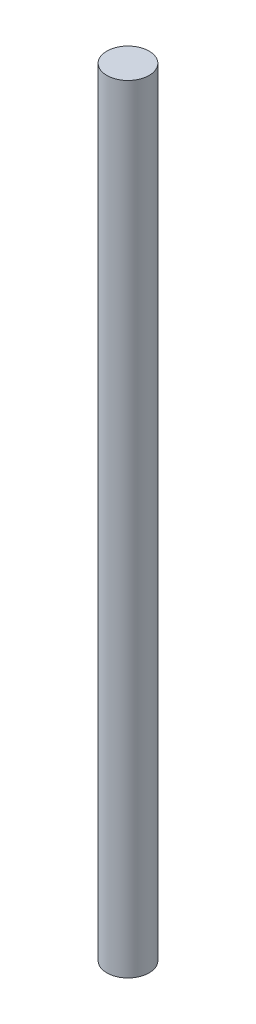
ISO-10303-21;
HEADER;
FILE_DESCRIPTION(('STEP AP214'),'2;1');
FILE_NAME('part.step','',(''),(''),'','','');
FILE_SCHEMA(('AUTOMOTIVE_DESIGN { 1 0 10303 214 1 1 1 1 }'));
ENDSEC;
DATA;
#1=APPLICATION_CONTEXT('core data for automotive mechanical design processes');
#2=APPLICATION_PROTOCOL_DEFINITION('international standard','automotive_design',2000,#1);
#3=PRODUCT_CONTEXT('',#1,'mechanical');
#4=PRODUCT('Part','Part','',(#3));
#5=PRODUCT_RELATED_PRODUCT_CATEGORY('part','',(#4));
#6=PRODUCT_DEFINITION_FORMATION('','',#4);
#7=PRODUCT_DEFINITION_CONTEXT('part definition',#1,'design');
#8=PRODUCT_DEFINITION('design','',#6,#7);
#9=PRODUCT_DEFINITION_SHAPE('','',#8);
#10=(LENGTH_UNIT() NAMED_UNIT(*) SI_UNIT(.MILLI.,.METRE.));
#11=(NAMED_UNIT(*) PLANE_ANGLE_UNIT() SI_UNIT($,.RADIAN.));
#12=(NAMED_UNIT(*) SI_UNIT($,.STERADIAN.) SOLID_ANGLE_UNIT());
#13=UNCERTAINTY_MEASURE_WITH_UNIT(LENGTH_MEASURE(1.E-05),#10,'distance_accuracy_value','');
#14=(GEOMETRIC_REPRESENTATION_CONTEXT(3) GLOBAL_UNCERTAINTY_ASSIGNED_CONTEXT((#13)) GLOBAL_UNIT_ASSIGNED_CONTEXT((#10,
#11,#12)) REPRESENTATION_CONTEXT('',''));
#15=CARTESIAN_POINT('',(0.,0.,0.));
#16=DIRECTION('',(0.,0.,1.));
#17=DIRECTION('',(1.,0.,0.));
#18=AXIS2_PLACEMENT_3D('',#15,#16,#17);
#19=CARTESIAN_POINT('',(0.,184.,0.));
#20=DIRECTION('',(0.,-1.,0.));
#21=DIRECTION('',(0.,0.,-1.));
#22=AXIS2_PLACEMENT_3D('',#19,#20,#21);
#23=CYLINDRICAL_SURFACE('',#22,5.);
#24=CARTESIAN_POINT('',(0.,184.,0.));
#25=DIRECTION('',(0.,1.,0.));
#26=DIRECTION('',(0.,0.,1.));
#27=AXIS2_PLACEMENT_3D('',#24,#25,#26);
#28=CIRCLE('',#27,5.);
#29=CARTESIAN_POINT('',(0.,184.,5.));
#30=VERTEX_POINT('',#29);
#31=EDGE_CURVE('E10',#30,#30,#28,.T.);
#32=ORIENTED_EDGE('',*,*,#31,.F.);
#33=EDGE_LOOP('',(#32));
#34=FACE_BOUND('',#33,.T.);
#35=CARTESIAN_POINT('',(0.,0.,0.));
#36=DIRECTION('',(0.,1.,0.));
#37=DIRECTION('',(0.,0.,1.));
#38=AXIS2_PLACEMENT_3D('',#35,#36,#37);
#39=CIRCLE('',#38,5.);
#40=CARTESIAN_POINT('',(0.,0.,5.));
#41=VERTEX_POINT('',#40);
#42=EDGE_CURVE('E40',#41,#41,#39,.T.);
#43=ORIENTED_EDGE('',*,*,#42,.T.);
#44=EDGE_LOOP('',(#43));
#45=FACE_BOUND('',#44,.T.);
#46=ADVANCED_FACE('F37',(#34,#45),#23,.T.);
#47=CARTESIAN_POINT('',(0.,184.,0.));
#48=DIRECTION('',(0.,1.,0.));
#49=DIRECTION('',(0.,0.,1.));
#50=AXIS2_PLACEMENT_3D('',#47,#48,#49);
#51=PLANE('',#50);
#52=ORIENTED_EDGE('',*,*,#31,.T.);
#53=EDGE_LOOP('',(#52));
#54=FACE_BOUND('',#53,.T.);
#55=ADVANCED_FACE('F52',(#54),#51,.T.);
#56=CARTESIAN_POINT('',(0.,0.,0.));
#57=DIRECTION('',(0.,1.,0.));
#58=DIRECTION('',(0.,0.,1.));
#59=AXIS2_PLACEMENT_3D('',#56,#57,#58);
#60=PLANE('',#59);
#61=ORIENTED_EDGE('',*,*,#42,.F.);
#62=EDGE_LOOP('',(#61));
#63=FACE_BOUND('',#62,.T.);
#64=ADVANCED_FACE('F50',(#63),#60,.F.);
#65=CLOSED_SHELL('',(#46,#55,#64));
#66=MANIFOLD_SOLID_BREP('B2',#65);
#67=ADVANCED_BREP_SHAPE_REPRESENTATION('',(#18,#66),#14);
#68=SHAPE_DEFINITION_REPRESENTATION(#9,#67);
ENDSEC;
END-ISO-10303-21;
